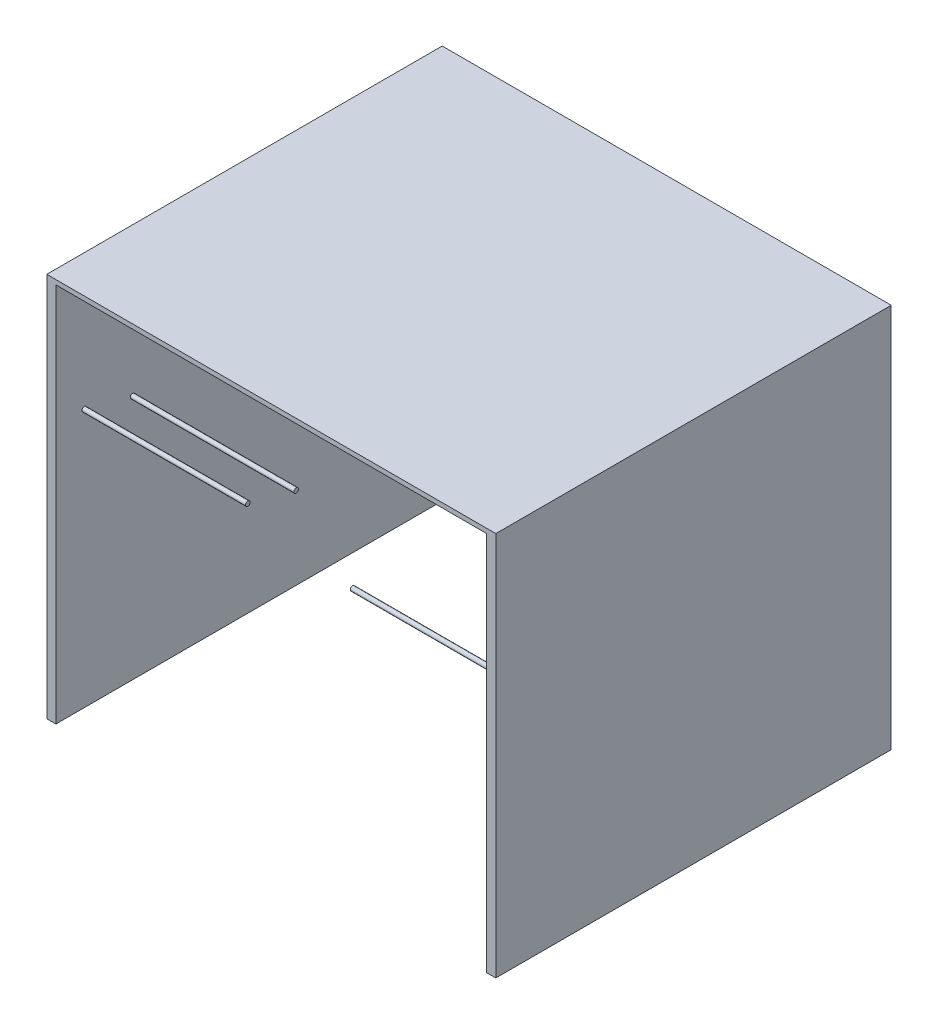
ISO-10303-21;
HEADER;
FILE_DESCRIPTION(('STEP AP214'),'2;1');
FILE_NAME('part.step','',(''),(''),'','','');
FILE_SCHEMA(('AUTOMOTIVE_DESIGN { 1 0 10303 214 1 1 1 1 }'));
ENDSEC;
DATA;
#1=APPLICATION_CONTEXT('core data for automotive mechanical design processes');
#2=APPLICATION_PROTOCOL_DEFINITION('international standard','automotive_design',2000,#1);
#3=PRODUCT_CONTEXT('',#1,'mechanical');
#4=PRODUCT('Part','Part','',(#3));
#5=PRODUCT_RELATED_PRODUCT_CATEGORY('part','',(#4));
#6=PRODUCT_DEFINITION_FORMATION('','',#4);
#7=PRODUCT_DEFINITION_CONTEXT('part definition',#1,'design');
#8=PRODUCT_DEFINITION('design','',#6,#7);
#9=PRODUCT_DEFINITION_SHAPE('','',#8);
#10=(LENGTH_UNIT() NAMED_UNIT(*) SI_UNIT(.MILLI.,.METRE.));
#11=(NAMED_UNIT(*) PLANE_ANGLE_UNIT() SI_UNIT($,.RADIAN.));
#12=(NAMED_UNIT(*) SI_UNIT($,.STERADIAN.) SOLID_ANGLE_UNIT());
#13=UNCERTAINTY_MEASURE_WITH_UNIT(LENGTH_MEASURE(1.E-05),#10,'distance_accuracy_value','');
#14=(GEOMETRIC_REPRESENTATION_CONTEXT(3) GLOBAL_UNCERTAINTY_ASSIGNED_CONTEXT((#13)) GLOBAL_UNIT_ASSIGNED_CONTEXT((#10,
#11,#12)) REPRESENTATION_CONTEXT('',''));
#15=CARTESIAN_POINT('',(0.,0.,0.));
#16=DIRECTION('',(0.,0.,1.));
#17=DIRECTION('',(1.,0.,0.));
#18=AXIS2_PLACEMENT_3D('',#15,#16,#17);
#19=CARTESIAN_POINT('',(0.,0.,0.));
#20=DIRECTION('',(0.,0.,-1.));
#21=DIRECTION('',(-1.,0.,0.));
#22=AXIS2_PLACEMENT_3D('',#19,#20,#21);
#23=PLANE('',#22);
#24=DIRECTION('',(-1.,0.,0.));
#25=VECTOR('',#24,1.);
#26=CARTESIAN_POINT('',(-240.,205.,0.));
#27=LINE('',#26,#25);
#28=CARTESIAN_POINT('',(230.,205.,0.));
#29=VERTEX_POINT('',#28);
#30=CARTESIAN_POINT('',(-240.,205.,0.));
#31=VERTEX_POINT('',#30);
#32=EDGE_CURVE('E178',#29,#31,#27,.T.);
#33=ORIENTED_EDGE('',*,*,#32,.T.);
#34=DIRECTION('',(0.,-1.,0.));
#35=VECTOR('',#34,1.);
#36=CARTESIAN_POINT('',(-240.,210.,0.));
#37=LINE('',#36,#35);
#38=CARTESIAN_POINT('',(-240.,-210.,0.));
#39=VERTEX_POINT('',#38);
#40=EDGE_CURVE('E163',#31,#39,#37,.T.);
#41=ORIENTED_EDGE('',*,*,#40,.T.);
#42=DIRECTION('',(1.,0.,0.));
#43=VECTOR('',#42,1.);
#44=CARTESIAN_POINT('',(-250.,-210.,0.));
#45=LINE('',#44,#43);
#46=CARTESIAN_POINT('',(-250.,-210.,0.));
#47=VERTEX_POINT('',#46);
#48=EDGE_CURVE('E144',#47,#39,#45,.T.);
#49=ORIENTED_EDGE('',*,*,#48,.F.);
#50=DIRECTION('',(0.,-1.,0.));
#51=VECTOR('',#50,1.);
#52=CARTESIAN_POINT('',(-250.,210.,0.));
#53=LINE('',#52,#51);
#54=CARTESIAN_POINT('',(-250.,210.,0.));
#55=VERTEX_POINT('',#54);
#56=EDGE_CURVE('E151',#55,#47,#53,.T.);
#57=ORIENTED_EDGE('',*,*,#56,.F.);
#58=DIRECTION('',(1.,0.,0.));
#59=VECTOR('',#58,1.);
#60=CARTESIAN_POINT('',(0.,210.,0.));
#61=LINE('',#60,#59);
#62=CARTESIAN_POINT('',(240.,210.,0.));
#63=VERTEX_POINT('',#62);
#64=EDGE_CURVE('E189',#55,#63,#61,.T.);
#65=ORIENTED_EDGE('',*,*,#64,.T.);
#66=DIRECTION('',(0.,-1.,0.));
#67=VECTOR('',#66,1.);
#68=CARTESIAN_POINT('',(240.,0.,0.));
#69=LINE('',#68,#67);
#70=CARTESIAN_POINT('',(240.,-210.,0.));
#71=VERTEX_POINT('',#70);
#72=EDGE_CURVE('E197',#63,#71,#69,.T.);
#73=ORIENTED_EDGE('',*,*,#72,.T.);
#74=DIRECTION('',(1.,0.,0.));
#75=VECTOR('',#74,1.);
#76=CARTESIAN_POINT('',(0.,-210.,0.));
#77=LINE('',#76,#75);
#78=CARTESIAN_POINT('',(230.,-210.,0.));
#79=VERTEX_POINT('',#78);
#80=EDGE_CURVE('E95',#79,#71,#77,.T.);
#81=ORIENTED_EDGE('',*,*,#80,.F.);
#82=DIRECTION('',(0.,-1.,0.));
#83=VECTOR('',#82,1.);
#84=CARTESIAN_POINT('',(230.,0.,0.));
#85=LINE('',#84,#83);
#86=EDGE_CURVE('E80',#29,#79,#85,.T.);
#87=ORIENTED_EDGE('',*,*,#86,.F.);
#88=EDGE_LOOP('',(#33,#41,#49,#57,#65,#73,#81,#87));
#89=FACE_BOUND('',#88,.T.);
#90=ADVANCED_FACE('F63',(#89),#23,.T.);
#91=CARTESIAN_POINT('',(0.,0.,431.51));
#92=DIRECTION('',(0.,0.,-1.));
#93=DIRECTION('',(-1.,0.,0.));
#94=AXIS2_PLACEMENT_3D('',#91,#92,#93);
#95=PLANE('',#94);
#96=DIRECTION('',(1.,0.,0.));
#97=VECTOR('',#96,1.);
#98=CARTESIAN_POINT('',(0.,210.,431.51));
#99=LINE('',#98,#97);
#100=CARTESIAN_POINT('',(-250.,210.,431.51));
#101=VERTEX_POINT('',#100);
#102=CARTESIAN_POINT('',(240.,210.,431.51));
#103=VERTEX_POINT('',#102);
#104=EDGE_CURVE('E192',#101,#103,#99,.T.);
#105=ORIENTED_EDGE('',*,*,#104,.F.);
#106=DIRECTION('',(0.,1.,0.));
#107=VECTOR('',#106,1.);
#108=CARTESIAN_POINT('',(-250.,210.,431.51));
#109=LINE('',#108,#107);
#110=CARTESIAN_POINT('',(-250.,-210.,431.51));
#111=VERTEX_POINT('',#110);
#112=EDGE_CURVE('E150',#111,#101,#109,.T.);
#113=ORIENTED_EDGE('',*,*,#112,.F.);
#114=DIRECTION('',(1.,0.,0.));
#115=VECTOR('',#114,1.);
#116=CARTESIAN_POINT('',(-250.,-210.,431.51));
#117=LINE('',#116,#115);
#118=CARTESIAN_POINT('',(-240.,-210.,431.51));
#119=VERTEX_POINT('',#118);
#120=EDGE_CURVE('E146',#111,#119,#117,.T.);
#121=ORIENTED_EDGE('',*,*,#120,.T.);
#122=DIRECTION('',(0.,1.,0.));
#123=VECTOR('',#122,1.);
#124=CARTESIAN_POINT('',(-240.,210.,431.51));
#125=LINE('',#124,#123);
#126=CARTESIAN_POINT('',(-240.,205.,431.51));
#127=VERTEX_POINT('',#126);
#128=EDGE_CURVE('E160',#119,#127,#125,.T.);
#129=ORIENTED_EDGE('',*,*,#128,.T.);
#130=DIRECTION('',(-1.,0.,0.));
#131=VECTOR('',#130,1.);
#132=CARTESIAN_POINT('',(-240.,205.,431.51));
#133=LINE('',#132,#131);
#134=CARTESIAN_POINT('',(230.,205.,431.51));
#135=VERTEX_POINT('',#134);
#136=EDGE_CURVE('E119',#135,#127,#133,.T.);
#137=ORIENTED_EDGE('',*,*,#136,.F.);
#138=DIRECTION('',(0.,-1.,0.));
#139=VECTOR('',#138,1.);
#140=CARTESIAN_POINT('',(230.,0.,431.51));
#141=LINE('',#140,#139);
#142=CARTESIAN_POINT('',(230.,-210.,431.51));
#143=VERTEX_POINT('',#142);
#144=EDGE_CURVE('E103',#135,#143,#141,.T.);
#145=ORIENTED_EDGE('',*,*,#144,.T.);
#146=DIRECTION('',(1.,0.,0.));
#147=VECTOR('',#146,1.);
#148=CARTESIAN_POINT('',(0.,-210.,431.51));
#149=LINE('',#148,#147);
#150=CARTESIAN_POINT('',(240.,-210.,431.51));
#151=VERTEX_POINT('',#150);
#152=EDGE_CURVE('E186',#143,#151,#149,.T.);
#153=ORIENTED_EDGE('',*,*,#152,.T.);
#154=DIRECTION('',(0.,-1.,0.));
#155=VECTOR('',#154,1.);
#156=CARTESIAN_POINT('',(240.,0.,431.51));
#157=LINE('',#156,#155);
#158=EDGE_CURVE('E188',#103,#151,#157,.T.);
#159=ORIENTED_EDGE('',*,*,#158,.F.);
#160=EDGE_LOOP('',(#105,#113,#121,#129,#137,#145,#153,#159));
#161=FACE_BOUND('',#160,.T.);
#162=ADVANCED_FACE('F218',(#161),#95,.F.);
#163=CARTESIAN_POINT('',(230.,0.,431.51));
#164=DIRECTION('',(1.,0.,0.));
#165=DIRECTION('',(0.,0.,-1.));
#166=AXIS2_PLACEMENT_3D('',#163,#164,#165);
#167=PLANE('',#166);
#168=CARTESIAN_POINT('',(230.,75.92,427.35));
#169=DIRECTION('',(1.,0.,0.));
#170=DIRECTION('',(0.,0.,-1.));
#171=AXIS2_PLACEMENT_3D('',#168,#169,#170);
#172=CIRCLE('',#171,2.50000000000002);
#173=CARTESIAN_POINT('',(230.,75.92,424.85));
#174=VERTEX_POINT('',#173);
#175=EDGE_CURVE('E12',#174,#174,#172,.F.);
#176=ORIENTED_EDGE('',*,*,#175,.F.);
#177=EDGE_LOOP('',(#176));
#178=FACE_BOUND('',#177,.T.);
#179=CARTESIAN_POINT('',(230.,138.09,353.49));
#180=DIRECTION('',(1.,0.,0.));
#181=DIRECTION('',(0.,0.,-1.));
#182=AXIS2_PLACEMENT_3D('',#179,#180,#181);
#183=CIRCLE('',#182,2.50000000000002);
#184=CARTESIAN_POINT('',(230.,138.09,350.99));
#185=VERTEX_POINT('',#184);
#186=EDGE_CURVE('E72',#185,#185,#183,.F.);
#187=ORIENTED_EDGE('',*,*,#186,.F.);
#188=EDGE_LOOP('',(#187));
#189=FACE_BOUND('',#188,.T.);
#190=CARTESIAN_POINT('',(230.,-5.05,150.03));
#191=DIRECTION('',(1.,0.,0.));
#192=DIRECTION('',(0.,0.,-1.));
#193=AXIS2_PLACEMENT_3D('',#190,#191,#192);
#194=CIRCLE('',#193,7.50000000000001);
#195=CARTESIAN_POINT('',(230.,-5.05,142.53));
#196=VERTEX_POINT('',#195);
#197=EDGE_CURVE('E206',#196,#196,#194,.F.);
#198=ORIENTED_EDGE('',*,*,#197,.F.);
#199=EDGE_LOOP('',(#198));
#200=FACE_BOUND('',#199,.T.);
#201=ORIENTED_EDGE('',*,*,#86,.T.);
#202=DIRECTION('',(0.,0.,1.));
#203=VECTOR('',#202,1.);
#204=CARTESIAN_POINT('',(230.,-210.,431.51));
#205=LINE('',#204,#203);
#206=EDGE_CURVE('E204',#79,#143,#205,.T.);
#207=ORIENTED_EDGE('',*,*,#206,.T.);
#208=ORIENTED_EDGE('',*,*,#144,.F.);
#209=DIRECTION('',(0.,0.,1.));
#210=VECTOR('',#209,1.);
#211=CARTESIAN_POINT('',(230.,205.,0.));
#212=LINE('',#211,#210);
#213=EDGE_CURVE('E180',#29,#135,#212,.T.);
#214=ORIENTED_EDGE('',*,*,#213,.F.);
#215=EDGE_LOOP('',(#201,#207,#208,#214));
#216=FACE_BOUND('',#215,.T.);
#217=ADVANCED_FACE('F214',(#178,#189,#200,#216),#167,.F.);
#218=CARTESIAN_POINT('',(240.,0.,431.51));
#219=DIRECTION('',(1.,0.,0.));
#220=DIRECTION('',(0.,0.,-1.));
#221=AXIS2_PLACEMENT_3D('',#218,#219,#220);
#222=PLANE('',#221);
#223=ORIENTED_EDGE('',*,*,#72,.F.);
#224=DIRECTION('',(0.,0.,-1.));
#225=VECTOR('',#224,1.);
#226=CARTESIAN_POINT('',(240.,210.,431.51));
#227=LINE('',#226,#225);
#228=EDGE_CURVE('E195',#103,#63,#227,.T.);
#229=ORIENTED_EDGE('',*,*,#228,.F.);
#230=ORIENTED_EDGE('',*,*,#158,.T.);
#231=DIRECTION('',(0.,0.,-1.));
#232=VECTOR('',#231,1.);
#233=CARTESIAN_POINT('',(240.,-210.,431.51));
#234=LINE('',#233,#232);
#235=EDGE_CURVE('E202',#151,#71,#234,.T.);
#236=ORIENTED_EDGE('',*,*,#235,.T.);
#237=EDGE_LOOP('',(#223,#229,#230,#236));
#238=FACE_BOUND('',#237,.T.);
#239=ADVANCED_FACE('F217',(#238),#222,.T.);
#240=CARTESIAN_POINT('',(0.,210.,431.51));
#241=DIRECTION('',(0.,1.,0.));
#242=DIRECTION('',(0.,0.,1.));
#243=AXIS2_PLACEMENT_3D('',#240,#241,#242);
#244=PLANE('',#243);
#245=ORIENTED_EDGE('',*,*,#64,.F.);
#246=DIRECTION('',(0.,0.,-1.));
#247=VECTOR('',#246,1.);
#248=CARTESIAN_POINT('',(-250.,210.,0.));
#249=LINE('',#248,#247);
#250=EDGE_CURVE('E157',#101,#55,#249,.T.);
#251=ORIENTED_EDGE('',*,*,#250,.F.);
#252=ORIENTED_EDGE('',*,*,#104,.T.);
#253=ORIENTED_EDGE('',*,*,#228,.T.);
#254=EDGE_LOOP('',(#245,#251,#252,#253));
#255=FACE_BOUND('',#254,.T.);
#256=ADVANCED_FACE('F222',(#255),#244,.T.);
#257=CARTESIAN_POINT('',(0.,-210.,431.51));
#258=DIRECTION('',(0.,1.,0.));
#259=DIRECTION('',(0.,0.,1.));
#260=AXIS2_PLACEMENT_3D('',#257,#258,#259);
#261=PLANE('',#260);
#262=ORIENTED_EDGE('',*,*,#206,.F.);
#263=ORIENTED_EDGE('',*,*,#80,.T.);
#264=ORIENTED_EDGE('',*,*,#235,.F.);
#265=ORIENTED_EDGE('',*,*,#152,.F.);
#266=EDGE_LOOP('',(#262,#263,#264,#265));
#267=FACE_BOUND('',#266,.T.);
#268=ADVANCED_FACE('F65',(#267),#261,.F.);
#269=CARTESIAN_POINT('',(-240.,205.,0.));
#270=DIRECTION('',(0.,1.,0.));
#271=DIRECTION('',(0.,0.,1.));
#272=AXIS2_PLACEMENT_3D('',#269,#270,#271);
#273=PLANE('',#272);
#274=ORIENTED_EDGE('',*,*,#136,.T.);
#275=DIRECTION('',(0.,0.,1.));
#276=VECTOR('',#275,1.);
#277=CARTESIAN_POINT('',(-240.,205.,0.));
#278=LINE('',#277,#276);
#279=EDGE_CURVE('E111',#31,#127,#278,.T.);
#280=ORIENTED_EDGE('',*,*,#279,.F.);
#281=ORIENTED_EDGE('',*,*,#32,.F.);
#282=ORIENTED_EDGE('',*,*,#213,.T.);
#283=EDGE_LOOP('',(#274,#280,#281,#282));
#284=FACE_BOUND('',#283,.T.);
#285=ADVANCED_FACE('F221',(#284),#273,.F.);
#286=CARTESIAN_POINT('',(58.3344455797935,-5.05,150.03));
#287=DIRECTION('',(1.,0.,0.));
#288=DIRECTION('',(0.,0.,-1.));
#289=AXIS2_PLACEMENT_3D('',#286,#287,#288);
#290=CYLINDRICAL_SURFACE('',#289,7.50000000000001);
#291=ORIENTED_EDGE('',*,*,#197,.T.);
#292=EDGE_LOOP('',(#291));
#293=FACE_BOUND('',#292,.T.);
#294=CARTESIAN_POINT('',(79.54764901539,-5.05,150.03));
#295=DIRECTION('',(-1.,0.,0.));
#296=DIRECTION('',(0.,0.,1.));
#297=AXIS2_PLACEMENT_3D('',#294,#295,#296);
#298=CIRCLE('',#297,7.50000000000001);
#299=CARTESIAN_POINT('',(79.54764901539,-5.05,157.53));
#300=VERTEX_POINT('',#299);
#301=EDGE_CURVE('E175',#300,#300,#298,.T.);
#302=ORIENTED_EDGE('',*,*,#301,.F.);
#303=EDGE_LOOP('',(#302));
#304=FACE_BOUND('',#303,.T.);
#305=ADVANCED_FACE('F225',(#293,#304),#290,.T.);
#306=CARTESIAN_POINT('',(79.5476490153898,-9.61660527120671,49.4335978958635));
#307=DIRECTION('',(-1.,0.,0.));
#308=DIRECTION('',(0.,0.999945319956325,-0.0104573943907074));
#309=AXIS2_PLACEMENT_3D('',#306,#307,#308);
#310=PLANE('',#309);
#311=ORIENTED_EDGE('',*,*,#301,.T.);
#312=EDGE_LOOP('',(#311));
#313=FACE_BOUND('',#312,.T.);
#314=ADVANCED_FACE('F228',(#313),#310,.T.);
#315=CARTESIAN_POINT('',(58.3344455797935,138.09,353.49));
#316=DIRECTION('',(1.,0.,0.));
#317=DIRECTION('',(0.,0.,-1.));
#318=AXIS2_PLACEMENT_3D('',#315,#316,#317);
#319=CYLINDRICAL_SURFACE('',#318,2.50000000000002);
#320=ORIENTED_EDGE('',*,*,#186,.T.);
#321=EDGE_LOOP('',(#320));
#322=FACE_BOUND('',#321,.T.);
#323=CARTESIAN_POINT('',(79.5476490153903,138.09,353.49));
#324=DIRECTION('',(-1.,0.,0.));
#325=DIRECTION('',(0.,0.,1.));
#326=AXIS2_PLACEMENT_3D('',#323,#324,#325);
#327=CIRCLE('',#326,2.50000000000002);
#328=CARTESIAN_POINT('',(79.5476490153903,138.09,355.99));
#329=VERTEX_POINT('',#328);
#330=EDGE_CURVE('E168',#329,#329,#327,.T.);
#331=ORIENTED_EDGE('',*,*,#330,.F.);
#332=EDGE_LOOP('',(#331));
#333=FACE_BOUND('',#332,.T.);
#334=ADVANCED_FACE('F211',(#322,#333),#319,.T.);
#335=CARTESIAN_POINT('',(79.5476490153898,-9.61660527120671,49.4335978958635));
#336=DIRECTION('',(-1.,0.,0.));
#337=DIRECTION('',(0.,0.999945319956325,-0.0104573943907074));
#338=AXIS2_PLACEMENT_3D('',#335,#336,#337);
#339=PLANE('',#338);
#340=ORIENTED_EDGE('',*,*,#330,.T.);
#341=EDGE_LOOP('',(#340));
#342=FACE_BOUND('',#341,.T.);
#343=ADVANCED_FACE('F237',(#342),#339,.T.);
#344=CARTESIAN_POINT('',(58.3344455797935,75.92,427.35));
#345=DIRECTION('',(1.,0.,0.));
#346=DIRECTION('',(0.,0.,-1.));
#347=AXIS2_PLACEMENT_3D('',#344,#345,#346);
#348=CYLINDRICAL_SURFACE('',#347,2.50000000000002);
#349=ORIENTED_EDGE('',*,*,#175,.T.);
#350=EDGE_LOOP('',(#349));
#351=FACE_BOUND('',#350,.T.);
#352=CARTESIAN_POINT('',(79.5476490153903,75.92,427.35));
#353=DIRECTION('',(-1.,0.,0.));
#354=DIRECTION('',(0.,0.,1.));
#355=AXIS2_PLACEMENT_3D('',#352,#353,#354);
#356=CIRCLE('',#355,2.50000000000002);
#357=CARTESIAN_POINT('',(79.5476490153903,75.92,429.85));
#358=VERTEX_POINT('',#357);
#359=EDGE_CURVE('E165',#358,#358,#356,.T.);
#360=ORIENTED_EDGE('',*,*,#359,.F.);
#361=EDGE_LOOP('',(#360));
#362=FACE_BOUND('',#361,.T.);
#363=ADVANCED_FACE('F279',(#351,#362),#348,.T.);
#364=CARTESIAN_POINT('',(79.5476490153898,-9.61660527120671,49.4335978958635));
#365=DIRECTION('',(-1.,0.,0.));
#366=DIRECTION('',(0.,0.999945319956325,-0.0104573943907074));
#367=AXIS2_PLACEMENT_3D('',#364,#365,#366);
#368=PLANE('',#367);
#369=ORIENTED_EDGE('',*,*,#359,.T.);
#370=EDGE_LOOP('',(#369));
#371=FACE_BOUND('',#370,.T.);
#372=ADVANCED_FACE('F271',(#371),#368,.T.);
#373=CARTESIAN_POINT('',(-240.,0.,0.));
#374=DIRECTION('',(-1.,0.,0.));
#375=DIRECTION('',(0.,-1.,0.));
#376=AXIS2_PLACEMENT_3D('',#373,#374,#375);
#377=PLANE('',#376);
#378=CARTESIAN_POINT('',(-240.,-5.04999999999992,150.03));
#379=DIRECTION('',(-1.,0.,0.));
#380=DIRECTION('',(0.,-1.,0.));
#381=AXIS2_PLACEMENT_3D('',#378,#379,#380);
#382=CIRCLE('',#381,7.50000000000001);
#383=CARTESIAN_POINT('',(-240.,-12.5499999999999,150.03));
#384=VERTEX_POINT('',#383);
#385=EDGE_CURVE('E509',#384,#384,#382,.T.);
#386=ORIENTED_EDGE('',*,*,#385,.T.);
#387=EDGE_LOOP('',(#386));
#388=FACE_BOUND('',#387,.T.);
#389=CARTESIAN_POINT('',(-240.,72.1700000000001,400.68));
#390=DIRECTION('',(-1.,0.,0.));
#391=DIRECTION('',(0.,-1.,0.));
#392=AXIS2_PLACEMENT_3D('',#389,#390,#391);
#393=CIRCLE('',#392,2.50000000000002);
#394=CARTESIAN_POINT('',(-240.,69.6700000000001,400.68));
#395=VERTEX_POINT('',#394);
#396=EDGE_CURVE('E513',#395,#395,#393,.T.);
#397=ORIENTED_EDGE('',*,*,#396,.T.);
#398=EDGE_LOOP('',(#397));
#399=FACE_BOUND('',#398,.T.);
#400=CARTESIAN_POINT('',(-240.,58.1600000000001,347.87));
#401=DIRECTION('',(-1.,0.,0.));
#402=DIRECTION('',(0.,-1.,0.));
#403=AXIS2_PLACEMENT_3D('',#400,#401,#402);
#404=CIRCLE('',#403,2.50000000000002);
#405=CARTESIAN_POINT('',(-240.,55.66,347.87));
#406=VERTEX_POINT('',#405);
#407=EDGE_CURVE('E265',#406,#406,#404,.T.);
#408=ORIENTED_EDGE('',*,*,#407,.T.);
#409=EDGE_LOOP('',(#408));
#410=FACE_BOUND('',#409,.T.);
#411=ORIENTED_EDGE('',*,*,#40,.F.);
#412=ORIENTED_EDGE('',*,*,#279,.T.);
#413=ORIENTED_EDGE('',*,*,#128,.F.);
#414=DIRECTION('',(0.,0.,1.));
#415=VECTOR('',#414,1.);
#416=CARTESIAN_POINT('',(-240.,-210.,0.));
#417=LINE('',#416,#415);
#418=EDGE_CURVE('E264',#39,#119,#417,.T.);
#419=ORIENTED_EDGE('',*,*,#418,.F.);
#420=EDGE_LOOP('',(#411,#412,#413,#419));
#421=FACE_BOUND('',#420,.T.);
#422=ADVANCED_FACE('F269',(#388,#399,#410,#421),#377,.F.);
#423=CARTESIAN_POINT('',(-250.,-210.,0.));
#424=DIRECTION('',(0.,1.,0.));
#425=DIRECTION('',(-1.,0.,0.));
#426=AXIS2_PLACEMENT_3D('',#423,#424,#425);
#427=PLANE('',#426);
#428=ORIENTED_EDGE('',*,*,#418,.T.);
#429=ORIENTED_EDGE('',*,*,#120,.F.);
#430=DIRECTION('',(0.,0.,1.));
#431=VECTOR('',#430,1.);
#432=CARTESIAN_POINT('',(-250.,-210.,0.));
#433=LINE('',#432,#431);
#434=EDGE_CURVE('E140',#47,#111,#433,.T.);
#435=ORIENTED_EDGE('',*,*,#434,.F.);
#436=ORIENTED_EDGE('',*,*,#48,.T.);
#437=EDGE_LOOP('',(#428,#429,#435,#436));
#438=FACE_BOUND('',#437,.T.);
#439=ADVANCED_FACE('F142',(#438),#427,.F.);
#440=CARTESIAN_POINT('',(-250.,0.,0.));
#441=DIRECTION('',(-1.,0.,0.));
#442=DIRECTION('',(0.,-1.,0.));
#443=AXIS2_PLACEMENT_3D('',#440,#441,#442);
#444=PLANE('',#443);
#445=ORIENTED_EDGE('',*,*,#56,.T.);
#446=ORIENTED_EDGE('',*,*,#434,.T.);
#447=ORIENTED_EDGE('',*,*,#112,.T.);
#448=ORIENTED_EDGE('',*,*,#250,.T.);
#449=EDGE_LOOP('',(#445,#446,#447,#448));
#450=FACE_BOUND('',#449,.T.);
#451=ADVANCED_FACE('F155',(#450),#444,.T.);
#452=CARTESIAN_POINT('',(-61.45,58.1600000000001,347.87));
#453=DIRECTION('',(-1.,0.,0.));
#454=DIRECTION('',(0.,-1.,0.));
#455=AXIS2_PLACEMENT_3D('',#452,#453,#454);
#456=CYLINDRICAL_SURFACE('',#455,2.50000000000002);
#457=CARTESIAN_POINT('',(-61.45,58.1600000000001,347.87));
#458=DIRECTION('',(-1.,0.,0.));
#459=DIRECTION('',(0.,-1.,0.));
#460=AXIS2_PLACEMENT_3D('',#457,#458,#459);
#461=CIRCLE('',#460,2.50000000000002);
#462=CARTESIAN_POINT('',(-61.45,55.66,347.87));
#463=VERTEX_POINT('',#462);
#464=EDGE_CURVE('E519',#463,#463,#461,.T.);
#465=ORIENTED_EDGE('',*,*,#464,.T.);
#466=EDGE_LOOP('',(#465));
#467=FACE_BOUND('',#466,.T.);
#468=ORIENTED_EDGE('',*,*,#407,.F.);
#469=EDGE_LOOP('',(#468));
#470=FACE_BOUND('',#469,.T.);
#471=ADVANCED_FACE('F349',(#467,#470),#456,.T.);
#472=CARTESIAN_POINT('',(-61.45,58.1600000000001,347.87));
#473=DIRECTION('',(-1.,0.,0.));
#474=DIRECTION('',(0.,-1.,0.));
#475=AXIS2_PLACEMENT_3D('',#472,#473,#474);
#476=PLANE('',#475);
#477=ORIENTED_EDGE('',*,*,#464,.F.);
#478=EDGE_LOOP('',(#477));
#479=FACE_BOUND('',#478,.T.);
#480=ADVANCED_FACE('F354',(#479),#476,.F.);
#481=CARTESIAN_POINT('',(-61.45,72.1700000000001,400.68));
#482=DIRECTION('',(-1.,0.,0.));
#483=DIRECTION('',(0.,-1.,0.));
#484=AXIS2_PLACEMENT_3D('',#481,#482,#483);
#485=CYLINDRICAL_SURFACE('',#484,2.50000000000002);
#486=CARTESIAN_POINT('',(-61.45,72.1700000000001,400.68));
#487=DIRECTION('',(-1.,0.,0.));
#488=DIRECTION('',(0.,-1.,0.));
#489=AXIS2_PLACEMENT_3D('',#486,#487,#488);
#490=CIRCLE('',#489,2.50000000000002);
#491=CARTESIAN_POINT('',(-61.45,69.67,400.68));
#492=VERTEX_POINT('',#491);
#493=EDGE_CURVE('E510',#492,#492,#490,.T.);
#494=ORIENTED_EDGE('',*,*,#493,.T.);
#495=EDGE_LOOP('',(#494));
#496=FACE_BOUND('',#495,.T.);
#497=ORIENTED_EDGE('',*,*,#396,.F.);
#498=EDGE_LOOP('',(#497));
#499=FACE_BOUND('',#498,.T.);
#500=ADVANCED_FACE('F364',(#496,#499),#485,.T.);
#501=CARTESIAN_POINT('',(-61.45,72.1700000000001,400.68));
#502=DIRECTION('',(-1.,0.,0.));
#503=DIRECTION('',(0.,-1.,0.));
#504=AXIS2_PLACEMENT_3D('',#501,#502,#503);
#505=PLANE('',#504);
#506=ORIENTED_EDGE('',*,*,#493,.F.);
#507=EDGE_LOOP('',(#506));
#508=FACE_BOUND('',#507,.T.);
#509=ADVANCED_FACE('F375',(#508),#505,.F.);
#510=CARTESIAN_POINT('',(-61.45,-5.04999999999994,150.03));
#511=DIRECTION('',(-1.,0.,0.));
#512=DIRECTION('',(0.,-1.,0.));
#513=AXIS2_PLACEMENT_3D('',#510,#511,#512);
#514=CYLINDRICAL_SURFACE('',#513,7.50000000000001);
#515=CARTESIAN_POINT('',(-61.45,-5.04999999999994,150.03));
#516=DIRECTION('',(-1.,0.,0.));
#517=DIRECTION('',(0.,-1.,0.));
#518=AXIS2_PLACEMENT_3D('',#515,#516,#517);
#519=CIRCLE('',#518,7.50000000000001);
#520=CARTESIAN_POINT('',(-61.45,-12.55,150.03));
#521=VERTEX_POINT('',#520);
#522=EDGE_CURVE('E507',#521,#521,#519,.T.);
#523=ORIENTED_EDGE('',*,*,#522,.T.);
#524=EDGE_LOOP('',(#523));
#525=FACE_BOUND('',#524,.T.);
#526=ORIENTED_EDGE('',*,*,#385,.F.);
#527=EDGE_LOOP('',(#526));
#528=FACE_BOUND('',#527,.T.);
#529=ADVANCED_FACE('F385',(#525,#528),#514,.T.);
#530=CARTESIAN_POINT('',(-61.45,-5.04999999999994,150.03));
#531=DIRECTION('',(-1.,0.,0.));
#532=DIRECTION('',(0.,-1.,0.));
#533=AXIS2_PLACEMENT_3D('',#530,#531,#532);
#534=PLANE('',#533);
#535=ORIENTED_EDGE('',*,*,#522,.F.);
#536=EDGE_LOOP('',(#535));
#537=FACE_BOUND('',#536,.T.);
#538=ADVANCED_FACE('F405',(#537),#534,.F.);
#539=CLOSED_SHELL('',(#90,#162,#217,#239,#256,#268,#285,#305,#314,#334,#343,#363,#372,#422,#439,
#451,#471,#480,#500,#509,#529,#538));
#540=MANIFOLD_SOLID_BREP('B2',#539);
#541=ADVANCED_BREP_SHAPE_REPRESENTATION('',(#18,#540),#14);
#542=SHAPE_DEFINITION_REPRESENTATION(#9,#541);
ENDSEC;
END-ISO-10303-21;
